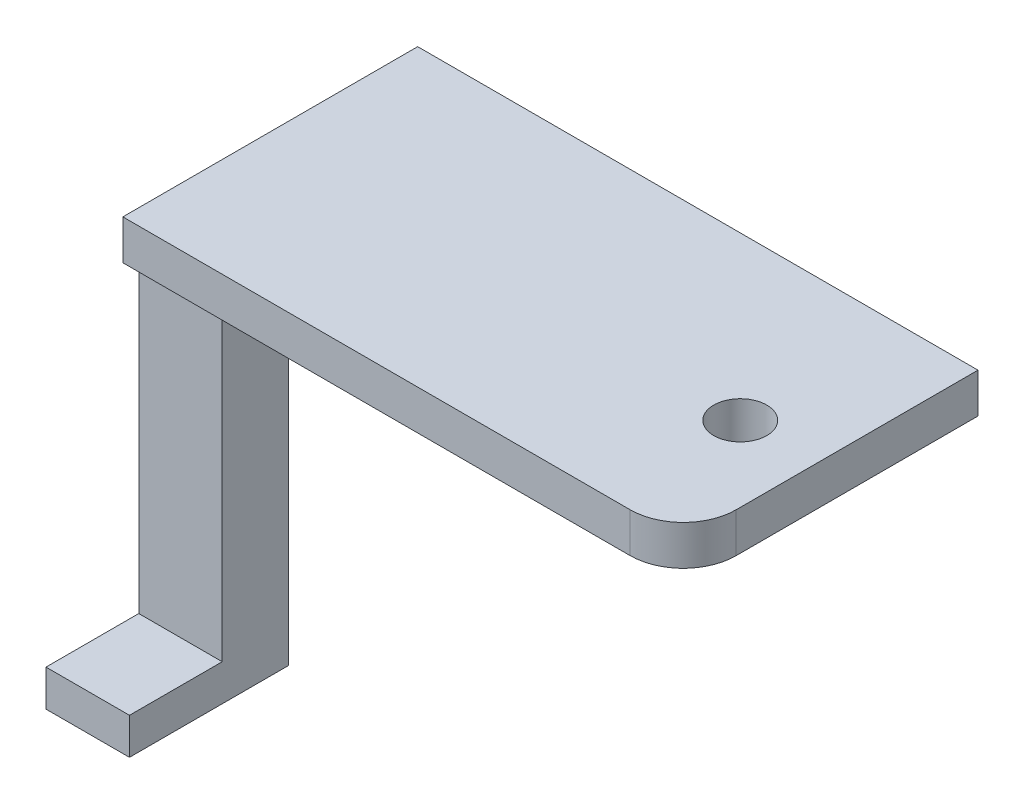
ISO-10303-21;
HEADER;
FILE_DESCRIPTION(('STEP AP214'),'2;1');
FILE_NAME('part.step','',(''),(''),'','','');
FILE_SCHEMA(('AUTOMOTIVE_DESIGN { 1 0 10303 214 1 1 1 1 }'));
ENDSEC;
DATA;
#1=APPLICATION_CONTEXT('core data for automotive mechanical design processes');
#2=APPLICATION_PROTOCOL_DEFINITION('international standard','automotive_design',2000,#1);
#3=PRODUCT_CONTEXT('',#1,'mechanical');
#4=PRODUCT('Part','Part','',(#3));
#5=PRODUCT_RELATED_PRODUCT_CATEGORY('part','',(#4));
#6=PRODUCT_DEFINITION_FORMATION('','',#4);
#7=PRODUCT_DEFINITION_CONTEXT('part definition',#1,'design');
#8=PRODUCT_DEFINITION('design','',#6,#7);
#9=PRODUCT_DEFINITION_SHAPE('','',#8);
#10=(LENGTH_UNIT() NAMED_UNIT(*) SI_UNIT(.MILLI.,.METRE.));
#11=(NAMED_UNIT(*) PLANE_ANGLE_UNIT() SI_UNIT($,.RADIAN.));
#12=(NAMED_UNIT(*) SI_UNIT($,.STERADIAN.) SOLID_ANGLE_UNIT());
#13=UNCERTAINTY_MEASURE_WITH_UNIT(LENGTH_MEASURE(1.E-05),#10,'distance_accuracy_value','');
#14=(GEOMETRIC_REPRESENTATION_CONTEXT(3) GLOBAL_UNCERTAINTY_ASSIGNED_CONTEXT((#13)) GLOBAL_UNIT_ASSIGNED_CONTEXT((#10,
#11,#12)) REPRESENTATION_CONTEXT('',''));
#15=CARTESIAN_POINT('',(0.,0.,0.));
#16=DIRECTION('',(0.,0.,1.));
#17=DIRECTION('',(1.,0.,0.));
#18=AXIS2_PLACEMENT_3D('',#15,#16,#17);
#19=CARTESIAN_POINT('',(0.,0.,0.));
#20=DIRECTION('',(0.,1.,0.));
#21=DIRECTION('',(0.,0.,1.));
#22=AXIS2_PLACEMENT_3D('',#19,#20,#21);
#23=PLANE('',#22);
#24=CARTESIAN_POINT('',(-5.69,0.,-10.));
#25=DIRECTION('',(0.,1.,0.));
#26=DIRECTION('',(0.,0.,1.));
#27=AXIS2_PLACEMENT_3D('',#24,#25,#26);
#28=CIRCLE('',#27,2.);
#29=CARTESIAN_POINT('',(-5.69,0.,-8.));
#30=VERTEX_POINT('',#29);
#31=EDGE_CURVE('E177',#30,#30,#28,.T.);
#32=ORIENTED_EDGE('',*,*,#31,.T.);
#33=EDGE_LOOP('',(#32));
#34=FACE_BOUND('',#33,.T.);
#35=DIRECTION('',(-1.,0.,0.));
#36=VECTOR('',#35,1.);
#37=CARTESIAN_POINT('',(-42.2846913621999,0.,-1.2));
#38=LINE('',#37,#36);
#39=CARTESIAN_POINT('',(-35.9846913621999,0.,-1.2));
#40=VERTEX_POINT('',#39);
#41=CARTESIAN_POINT('',(-42.2846913621999,0.,-1.2));
#42=VERTEX_POINT('',#41);
#43=EDGE_CURVE('E52',#40,#42,#38,.T.);
#44=ORIENTED_EDGE('',*,*,#43,.F.);
#45=DIRECTION('',(0.,0.,1.));
#46=VECTOR('',#45,1.);
#47=CARTESIAN_POINT('',(-35.9846913621999,0.,-1.2));
#48=LINE('',#47,#46);
#49=CARTESIAN_POINT('',(-35.9846913621999,0.,-6.2));
#50=VERTEX_POINT('',#49);
#51=EDGE_CURVE('E164',#50,#40,#48,.T.);
#52=ORIENTED_EDGE('',*,*,#51,.F.);
#53=DIRECTION('',(1.,0.,0.));
#54=VECTOR('',#53,1.);
#55=CARTESIAN_POINT('',(-42.2846913621999,0.,-6.2));
#56=LINE('',#55,#54);
#57=CARTESIAN_POINT('',(-42.2846913621999,0.,-6.2));
#58=VERTEX_POINT('',#57);
#59=EDGE_CURVE('E58',#58,#50,#56,.T.);
#60=ORIENTED_EDGE('',*,*,#59,.F.);
#61=DIRECTION('',(0.,0.,-1.));
#62=VECTOR('',#61,1.);
#63=CARTESIAN_POINT('',(-42.2846913621999,0.,0.));
#64=LINE('',#63,#62);
#65=CARTESIAN_POINT('',(-42.2846913621999,0.,-22.25));
#66=VERTEX_POINT('',#65);
#67=EDGE_CURVE('E126',#58,#66,#64,.T.);
#68=ORIENTED_EDGE('',*,*,#67,.T.);
#69=DIRECTION('',(1.,0.,0.));
#70=VECTOR('',#69,1.);
#71=CARTESIAN_POINT('',(0.,0.,-22.25));
#72=LINE('',#71,#70);
#73=CARTESIAN_POINT('',(0.,0.,-22.25));
#74=VERTEX_POINT('',#73);
#75=EDGE_CURVE('E198',#66,#74,#72,.T.);
#76=ORIENTED_EDGE('',*,*,#75,.T.);
#77=DIRECTION('',(0.,0.,-1.));
#78=VECTOR('',#77,1.);
#79=CARTESIAN_POINT('',(0.,0.,0.));
#80=LINE('',#79,#78);
#81=CARTESIAN_POINT('',(0.,0.,-4.00000000000003));
#82=VERTEX_POINT('',#81);
#83=EDGE_CURVE('E195',#82,#74,#80,.T.);
#84=ORIENTED_EDGE('',*,*,#83,.F.);
#85=CARTESIAN_POINT('',(-4.,0.,-4.));
#86=DIRECTION('',(0.,1.,0.));
#87=DIRECTION('',(0.,0.,1.));
#88=AXIS2_PLACEMENT_3D('',#85,#86,#87);
#89=CIRCLE('',#88,4.);
#90=CARTESIAN_POINT('',(-4.00000000000003,0.,0.));
#91=VERTEX_POINT('',#90);
#92=EDGE_CURVE('E193',#91,#82,#89,.T.);
#93=ORIENTED_EDGE('',*,*,#92,.F.);
#94=DIRECTION('',(-1.,0.,0.));
#95=VECTOR('',#94,1.);
#96=CARTESIAN_POINT('',(0.,0.,0.));
#97=LINE('',#96,#95);
#98=CARTESIAN_POINT('',(-42.2846913621999,0.,0.));
#99=VERTEX_POINT('',#98);
#100=EDGE_CURVE('E128',#91,#99,#97,.T.);
#101=ORIENTED_EDGE('',*,*,#100,.T.);
#102=EDGE_CURVE('E201',#99,#42,#64,.T.);
#103=ORIENTED_EDGE('',*,*,#102,.T.);
#104=EDGE_LOOP('',(#44,#52,#60,#68,#76,#84,#93,#101,#103));
#105=FACE_BOUND('',#104,.T.);
#106=ADVANCED_FACE('F37',(#34,#105),#23,.F.);
#107=CARTESIAN_POINT('',(0.,3.,0.));
#108=DIRECTION('',(0.,0.,1.));
#109=DIRECTION('',(1.,0.,0.));
#110=AXIS2_PLACEMENT_3D('',#107,#108,#109);
#111=PLANE('',#110);
#112=ORIENTED_EDGE('',*,*,#100,.F.);
#113=DIRECTION('',(0.,-1.,0.));
#114=VECTOR('',#113,1.);
#115=CARTESIAN_POINT('',(-4.00000000000003,3.,0.));
#116=LINE('',#115,#114);
#117=CARTESIAN_POINT('',(-4.00000000000003,3.,0.));
#118=VERTEX_POINT('',#117);
#119=EDGE_CURVE('E11',#118,#91,#116,.T.);
#120=ORIENTED_EDGE('',*,*,#119,.F.);
#121=DIRECTION('',(-1.,0.,0.));
#122=VECTOR('',#121,1.);
#123=CARTESIAN_POINT('',(0.,3.,0.));
#124=LINE('',#123,#122);
#125=CARTESIAN_POINT('',(-42.2846913621999,3.,0.));
#126=VERTEX_POINT('',#125);
#127=EDGE_CURVE('E173',#118,#126,#124,.T.);
#128=ORIENTED_EDGE('',*,*,#127,.T.);
#129=DIRECTION('',(0.,-1.,0.));
#130=VECTOR('',#129,1.);
#131=CARTESIAN_POINT('',(-42.2846913621999,3.,0.));
#132=LINE('',#131,#130);
#133=EDGE_CURVE('E190',#126,#99,#132,.T.);
#134=ORIENTED_EDGE('',*,*,#133,.T.);
#135=EDGE_LOOP('',(#112,#120,#128,#134));
#136=FACE_BOUND('',#135,.T.);
#137=ADVANCED_FACE('F39',(#136),#111,.T.);
#138=CARTESIAN_POINT('',(-4.,3.,-4.));
#139=DIRECTION('',(0.,-1.,0.));
#140=DIRECTION('',(0.,0.,-1.));
#141=AXIS2_PLACEMENT_3D('',#138,#139,#140);
#142=CYLINDRICAL_SURFACE('',#141,4.);
#143=ORIENTED_EDGE('',*,*,#92,.T.);
#144=DIRECTION('',(0.,-1.,0.));
#145=VECTOR('',#144,1.);
#146=CARTESIAN_POINT('',(0.,3.,-4.00000000000003));
#147=LINE('',#146,#145);
#148=CARTESIAN_POINT('',(0.,3.,-4.00000000000003));
#149=VERTEX_POINT('',#148);
#150=EDGE_CURVE('E45',#149,#82,#147,.T.);
#151=ORIENTED_EDGE('',*,*,#150,.F.);
#152=CARTESIAN_POINT('',(-4.,3.,-4.));
#153=DIRECTION('',(0.,1.,0.));
#154=DIRECTION('',(0.,0.,1.));
#155=AXIS2_PLACEMENT_3D('',#152,#153,#154);
#156=CIRCLE('',#155,4.);
#157=EDGE_CURVE('E176',#118,#149,#156,.T.);
#158=ORIENTED_EDGE('',*,*,#157,.F.);
#159=ORIENTED_EDGE('',*,*,#119,.T.);
#160=EDGE_LOOP('',(#143,#151,#158,#159));
#161=FACE_BOUND('',#160,.T.);
#162=ADVANCED_FACE('F230',(#161),#142,.T.);
#163=CARTESIAN_POINT('',(0.,3.,0.));
#164=DIRECTION('',(-1.,0.,0.));
#165=DIRECTION('',(0.,0.,1.));
#166=AXIS2_PLACEMENT_3D('',#163,#164,#165);
#167=PLANE('',#166);
#168=ORIENTED_EDGE('',*,*,#83,.T.);
#169=DIRECTION('',(0.,-1.,0.));
#170=VECTOR('',#169,1.);
#171=CARTESIAN_POINT('',(0.,3.,-22.25));
#172=LINE('',#171,#170);
#173=CARTESIAN_POINT('',(0.,3.,-22.25));
#174=VERTEX_POINT('',#173);
#175=EDGE_CURVE('E208',#174,#74,#172,.T.);
#176=ORIENTED_EDGE('',*,*,#175,.F.);
#177=DIRECTION('',(0.,0.,-1.));
#178=VECTOR('',#177,1.);
#179=CARTESIAN_POINT('',(0.,3.,0.));
#180=LINE('',#179,#178);
#181=EDGE_CURVE('E179',#149,#174,#180,.T.);
#182=ORIENTED_EDGE('',*,*,#181,.F.);
#183=ORIENTED_EDGE('',*,*,#150,.T.);
#184=EDGE_LOOP('',(#168,#176,#182,#183));
#185=FACE_BOUND('',#184,.T.);
#186=ADVANCED_FACE('F214',(#185),#167,.F.);
#187=CARTESIAN_POINT('',(0.,3.,-22.25));
#188=DIRECTION('',(0.,0.,-1.));
#189=DIRECTION('',(-1.,0.,0.));
#190=AXIS2_PLACEMENT_3D('',#187,#188,#189);
#191=PLANE('',#190);
#192=ORIENTED_EDGE('',*,*,#75,.F.);
#193=DIRECTION('',(0.,-1.,0.));
#194=VECTOR('',#193,1.);
#195=CARTESIAN_POINT('',(-42.2846913621999,3.,-22.25));
#196=LINE('',#195,#194);
#197=CARTESIAN_POINT('',(-42.2846913621999,3.,-22.25));
#198=VERTEX_POINT('',#197);
#199=EDGE_CURVE('E206',#198,#66,#196,.T.);
#200=ORIENTED_EDGE('',*,*,#199,.F.);
#201=DIRECTION('',(1.,0.,0.));
#202=VECTOR('',#201,1.);
#203=CARTESIAN_POINT('',(0.,3.,-22.25));
#204=LINE('',#203,#202);
#205=EDGE_CURVE('E181',#198,#174,#204,.T.);
#206=ORIENTED_EDGE('',*,*,#205,.T.);
#207=ORIENTED_EDGE('',*,*,#175,.T.);
#208=EDGE_LOOP('',(#192,#200,#206,#207));
#209=FACE_BOUND('',#208,.T.);
#210=ADVANCED_FACE('F222',(#209),#191,.T.);
#211=CARTESIAN_POINT('',(-42.2846913621999,3.,0.));
#212=DIRECTION('',(-1.,0.,0.));
#213=DIRECTION('',(0.,0.,1.));
#214=AXIS2_PLACEMENT_3D('',#211,#212,#213);
#215=PLANE('',#214);
#216=ORIENTED_EDGE('',*,*,#102,.F.);
#217=ORIENTED_EDGE('',*,*,#133,.F.);
#218=DIRECTION('',(0.,0.,-1.));
#219=VECTOR('',#218,1.);
#220=CARTESIAN_POINT('',(-42.2846913621999,3.,0.));
#221=LINE('',#220,#219);
#222=EDGE_CURVE('E184',#126,#198,#221,.T.);
#223=ORIENTED_EDGE('',*,*,#222,.T.);
#224=ORIENTED_EDGE('',*,*,#199,.T.);
#225=ORIENTED_EDGE('',*,*,#67,.F.);
#226=DIRECTION('',(0.,1.,0.));
#227=VECTOR('',#226,1.);
#228=CARTESIAN_POINT('',(-42.2846913621999,-23.525,-6.2));
#229=LINE('',#228,#227);
#230=CARTESIAN_POINT('',(-42.2846913621999,-26.275,-6.2));
#231=VERTEX_POINT('',#230);
#232=EDGE_CURVE('E118',#231,#58,#229,.T.);
#233=ORIENTED_EDGE('',*,*,#232,.F.);
#234=DIRECTION('',(0.,0.,-1.));
#235=VECTOR('',#234,1.);
#236=CARTESIAN_POINT('',(-42.2846913621999,-26.275,-6.2));
#237=LINE('',#236,#235);
#238=CARTESIAN_POINT('',(-42.2846913621999,-26.275,5.8));
#239=VERTEX_POINT('',#238);
#240=EDGE_CURVE('E124',#239,#231,#237,.T.);
#241=ORIENTED_EDGE('',*,*,#240,.F.);
#242=DIRECTION('',(0.,1.,0.));
#243=VECTOR('',#242,1.);
#244=CARTESIAN_POINT('',(-42.2846913621999,-26.275,5.8));
#245=LINE('',#244,#243);
#246=CARTESIAN_POINT('',(-42.2846913621999,-23.525,5.8));
#247=VERTEX_POINT('',#246);
#248=EDGE_CURVE('E150',#239,#247,#245,.T.);
#249=ORIENTED_EDGE('',*,*,#248,.T.);
#250=DIRECTION('',(0.,0.,-1.));
#251=VECTOR('',#250,1.);
#252=CARTESIAN_POINT('',(-42.2846913621999,-23.525,-6.2));
#253=LINE('',#252,#251);
#254=CARTESIAN_POINT('',(-42.2846913621999,-23.525,-1.2));
#255=VERTEX_POINT('',#254);
#256=EDGE_CURVE('E151',#247,#255,#253,.T.);
#257=ORIENTED_EDGE('',*,*,#256,.T.);
#258=DIRECTION('',(0.,1.,0.));
#259=VECTOR('',#258,1.);
#260=CARTESIAN_POINT('',(-42.2846913621999,-23.525,-1.2));
#261=LINE('',#260,#259);
#262=EDGE_CURVE('E162',#255,#42,#261,.T.);
#263=ORIENTED_EDGE('',*,*,#262,.T.);
#264=EDGE_LOOP('',(#216,#217,#223,#224,#225,#233,#241,#249,#257,#263));
#265=FACE_BOUND('',#264,.T.);
#266=ADVANCED_FACE('F121',(#265),#215,.T.);
#267=CARTESIAN_POINT('',(-5.69,3.,-10.));
#268=DIRECTION('',(0.,-1.,0.));
#269=DIRECTION('',(0.,0.,-1.));
#270=AXIS2_PLACEMENT_3D('',#267,#268,#269);
#271=CYLINDRICAL_SURFACE('',#270,2.);
#272=CARTESIAN_POINT('',(-5.69,3.,-10.));
#273=DIRECTION('',(0.,1.,0.));
#274=DIRECTION('',(0.,0.,1.));
#275=AXIS2_PLACEMENT_3D('',#272,#273,#274);
#276=CIRCLE('',#275,2.);
#277=CARTESIAN_POINT('',(-5.69,3.,-8.));
#278=VERTEX_POINT('',#277);
#279=EDGE_CURVE('E187',#278,#278,#276,.T.);
#280=ORIENTED_EDGE('',*,*,#279,.T.);
#281=EDGE_LOOP('',(#280));
#282=FACE_BOUND('',#281,.T.);
#283=ORIENTED_EDGE('',*,*,#31,.F.);
#284=EDGE_LOOP('',(#283));
#285=FACE_BOUND('',#284,.T.);
#286=ADVANCED_FACE('F245',(#282,#285),#271,.F.);
#287=CARTESIAN_POINT('',(0.,3.,0.));
#288=DIRECTION('',(0.,1.,0.));
#289=DIRECTION('',(0.,0.,1.));
#290=AXIS2_PLACEMENT_3D('',#287,#288,#289);
#291=PLANE('',#290);
#292=ORIENTED_EDGE('',*,*,#127,.F.);
#293=ORIENTED_EDGE('',*,*,#157,.T.);
#294=ORIENTED_EDGE('',*,*,#181,.T.);
#295=ORIENTED_EDGE('',*,*,#205,.F.);
#296=ORIENTED_EDGE('',*,*,#222,.F.);
#297=EDGE_LOOP('',(#292,#293,#294,#295,#296));
#298=FACE_BOUND('',#297,.T.);
#299=ORIENTED_EDGE('',*,*,#279,.F.);
#300=EDGE_LOOP('',(#299));
#301=FACE_BOUND('',#300,.T.);
#302=ADVANCED_FACE('F227',(#298,#301),#291,.T.);
#303=CARTESIAN_POINT('',(-42.2846913621999,-23.525,-6.2));
#304=DIRECTION('',(0.,0.,1.));
#305=DIRECTION('',(1.,0.,0.));
#306=AXIS2_PLACEMENT_3D('',#303,#304,#305);
#307=PLANE('',#306);
#308=ORIENTED_EDGE('',*,*,#59,.T.);
#309=DIRECTION('',(0.,1.,0.));
#310=VECTOR('',#309,1.);
#311=CARTESIAN_POINT('',(-35.9846913621999,-23.525,-6.2));
#312=LINE('',#311,#310);
#313=CARTESIAN_POINT('',(-35.9846913621999,-26.275,-6.2));
#314=VERTEX_POINT('',#313);
#315=EDGE_CURVE('E129',#314,#50,#312,.T.);
#316=ORIENTED_EDGE('',*,*,#315,.F.);
#317=DIRECTION('',(1.,0.,0.));
#318=VECTOR('',#317,1.);
#319=CARTESIAN_POINT('',(-42.2846913621999,-26.275,-6.2));
#320=LINE('',#319,#318);
#321=EDGE_CURVE('E132',#231,#314,#320,.T.);
#322=ORIENTED_EDGE('',*,*,#321,.F.);
#323=ORIENTED_EDGE('',*,*,#232,.T.);
#324=EDGE_LOOP('',(#308,#316,#322,#323));
#325=FACE_BOUND('',#324,.T.);
#326=ADVANCED_FACE('F133',(#325),#307,.F.);
#327=CARTESIAN_POINT('',(-35.9846913621999,-23.525,-1.2));
#328=DIRECTION('',(-1.,0.,0.));
#329=DIRECTION('',(0.,0.,1.));
#330=AXIS2_PLACEMENT_3D('',#327,#328,#329);
#331=PLANE('',#330);
#332=ORIENTED_EDGE('',*,*,#51,.T.);
#333=DIRECTION('',(0.,1.,0.));
#334=VECTOR('',#333,1.);
#335=CARTESIAN_POINT('',(-35.9846913621999,-23.525,-1.2));
#336=LINE('',#335,#334);
#337=CARTESIAN_POINT('',(-35.9846913621999,-23.525,-1.2));
#338=VERTEX_POINT('',#337);
#339=EDGE_CURVE('E169',#338,#40,#336,.T.);
#340=ORIENTED_EDGE('',*,*,#339,.F.);
#341=DIRECTION('',(0.,0.,1.));
#342=VECTOR('',#341,1.);
#343=CARTESIAN_POINT('',(-35.9846913621999,-23.525,-6.2));
#344=LINE('',#343,#342);
#345=CARTESIAN_POINT('',(-35.9846913621999,-23.525,5.8));
#346=VERTEX_POINT('',#345);
#347=EDGE_CURVE('E145',#338,#346,#344,.T.);
#348=ORIENTED_EDGE('',*,*,#347,.T.);
#349=DIRECTION('',(0.,1.,0.));
#350=VECTOR('',#349,1.);
#351=CARTESIAN_POINT('',(-35.9846913621999,-26.275,5.8));
#352=LINE('',#351,#350);
#353=CARTESIAN_POINT('',(-35.9846913621999,-26.275,5.8));
#354=VERTEX_POINT('',#353);
#355=EDGE_CURVE('E156',#354,#346,#352,.T.);
#356=ORIENTED_EDGE('',*,*,#355,.F.);
#357=DIRECTION('',(0.,0.,1.));
#358=VECTOR('',#357,1.);
#359=CARTESIAN_POINT('',(-35.9846913621999,-26.275,-6.2));
#360=LINE('',#359,#358);
#361=EDGE_CURVE('E137',#314,#354,#360,.T.);
#362=ORIENTED_EDGE('',*,*,#361,.F.);
#363=ORIENTED_EDGE('',*,*,#315,.T.);
#364=EDGE_LOOP('',(#332,#340,#348,#356,#362,#363));
#365=FACE_BOUND('',#364,.T.);
#366=ADVANCED_FACE('F275',(#365),#331,.F.);
#367=CARTESIAN_POINT('',(-42.2846913621999,-23.525,-1.2));
#368=DIRECTION('',(0.,0.,-1.));
#369=DIRECTION('',(-1.,0.,0.));
#370=AXIS2_PLACEMENT_3D('',#367,#368,#369);
#371=PLANE('',#370);
#372=ORIENTED_EDGE('',*,*,#43,.T.);
#373=ORIENTED_EDGE('',*,*,#262,.F.);
#374=DIRECTION('',(-1.,0.,0.));
#375=VECTOR('',#374,1.);
#376=CARTESIAN_POINT('',(-42.2846913621999,-23.525,-1.2));
#377=LINE('',#376,#375);
#378=EDGE_CURVE('E159',#338,#255,#377,.T.);
#379=ORIENTED_EDGE('',*,*,#378,.F.);
#380=ORIENTED_EDGE('',*,*,#339,.T.);
#381=EDGE_LOOP('',(#372,#373,#379,#380));
#382=FACE_BOUND('',#381,.T.);
#383=ADVANCED_FACE('F281',(#382),#371,.F.);
#384=CARTESIAN_POINT('',(-42.2846913621999,-26.275,5.8));
#385=DIRECTION('',(0.,0.,-1.));
#386=DIRECTION('',(-1.,0.,0.));
#387=AXIS2_PLACEMENT_3D('',#384,#385,#386);
#388=PLANE('',#387);
#389=DIRECTION('',(-1.,0.,0.));
#390=VECTOR('',#389,1.);
#391=CARTESIAN_POINT('',(-42.2846913621999,-23.525,5.8));
#392=LINE('',#391,#390);
#393=EDGE_CURVE('E143',#346,#247,#392,.T.);
#394=ORIENTED_EDGE('',*,*,#393,.T.);
#395=ORIENTED_EDGE('',*,*,#248,.F.);
#396=DIRECTION('',(-1.,0.,0.));
#397=VECTOR('',#396,1.);
#398=CARTESIAN_POINT('',(-42.2846913621999,-26.275,5.8));
#399=LINE('',#398,#397);
#400=EDGE_CURVE('E141',#354,#239,#399,.T.);
#401=ORIENTED_EDGE('',*,*,#400,.F.);
#402=ORIENTED_EDGE('',*,*,#355,.T.);
#403=EDGE_LOOP('',(#394,#395,#401,#402));
#404=FACE_BOUND('',#403,.T.);
#405=ADVANCED_FACE('F289',(#404),#388,.F.);
#406=CARTESIAN_POINT('',(0.,-26.275,0.));
#407=DIRECTION('',(0.,1.,0.));
#408=DIRECTION('',(0.,0.,1.));
#409=AXIS2_PLACEMENT_3D('',#406,#407,#408);
#410=PLANE('',#409);
#411=ORIENTED_EDGE('',*,*,#240,.T.);
#412=ORIENTED_EDGE('',*,*,#321,.T.);
#413=ORIENTED_EDGE('',*,*,#361,.T.);
#414=ORIENTED_EDGE('',*,*,#400,.T.);
#415=EDGE_LOOP('',(#411,#412,#413,#414));
#416=FACE_BOUND('',#415,.T.);
#417=ADVANCED_FACE('F139',(#416),#410,.F.);
#418=CARTESIAN_POINT('',(0.,-23.525,0.));
#419=DIRECTION('',(0.,1.,0.));
#420=DIRECTION('',(0.,0.,1.));
#421=AXIS2_PLACEMENT_3D('',#418,#419,#420);
#422=PLANE('',#421);
#423=ORIENTED_EDGE('',*,*,#347,.F.);
#424=ORIENTED_EDGE('',*,*,#378,.T.);
#425=ORIENTED_EDGE('',*,*,#256,.F.);
#426=ORIENTED_EDGE('',*,*,#393,.F.);
#427=EDGE_LOOP('',(#423,#424,#425,#426));
#428=FACE_BOUND('',#427,.T.);
#429=ADVANCED_FACE('F304',(#428),#422,.T.);
#430=CLOSED_SHELL('',(#106,#137,#162,#186,#210,#266,#286,#302,#326,#366,#383,#405,#417,#429));
#431=MANIFOLD_SOLID_BREP('B2',#430);
#432=ADVANCED_BREP_SHAPE_REPRESENTATION('',(#18,#431),#14);
#433=SHAPE_DEFINITION_REPRESENTATION(#9,#432);
ENDSEC;
END-ISO-10303-21;
